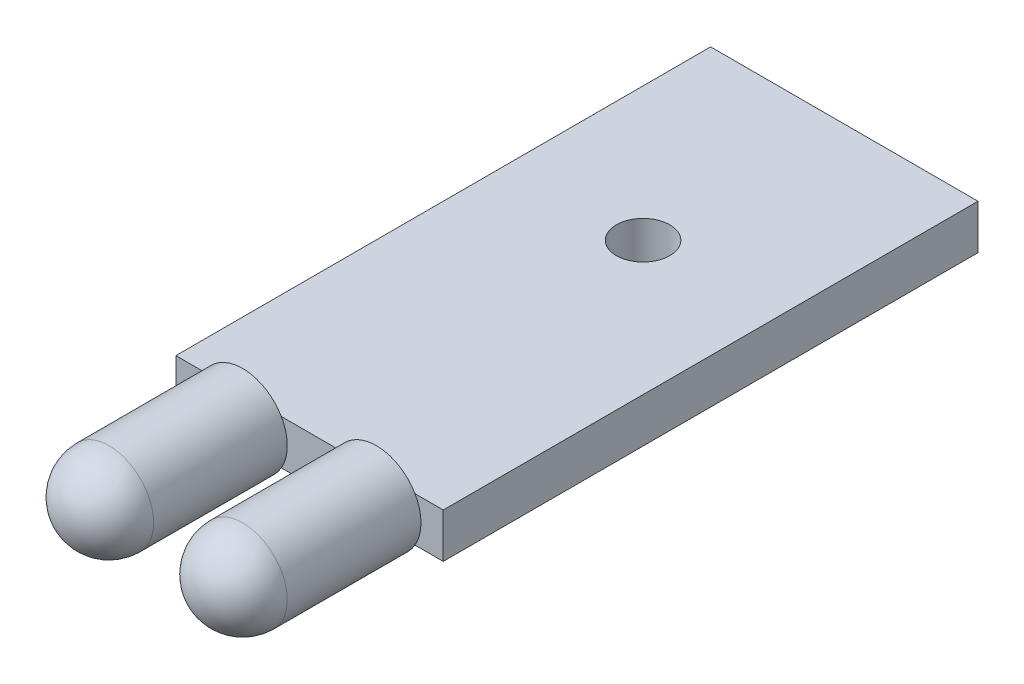
ISO-10303-21;
HEADER;
FILE_DESCRIPTION(('STEP AP214'),'2;1');
FILE_NAME('part.step','',(''),(''),'','','');
FILE_SCHEMA(('AUTOMOTIVE_DESIGN { 1 0 10303 214 1 1 1 1 }'));
ENDSEC;
DATA;
#1=APPLICATION_CONTEXT('core data for automotive mechanical design processes');
#2=APPLICATION_PROTOCOL_DEFINITION('international standard','automotive_design',2000,#1);
#3=PRODUCT_CONTEXT('',#1,'mechanical');
#4=PRODUCT('Part','Part','',(#3));
#5=PRODUCT_RELATED_PRODUCT_CATEGORY('part','',(#4));
#6=PRODUCT_DEFINITION_FORMATION('','',#4);
#7=PRODUCT_DEFINITION_CONTEXT('part definition',#1,'design');
#8=PRODUCT_DEFINITION('design','',#6,#7);
#9=PRODUCT_DEFINITION_SHAPE('','',#8);
#10=(LENGTH_UNIT() NAMED_UNIT(*) SI_UNIT(.MILLI.,.METRE.));
#11=(NAMED_UNIT(*) PLANE_ANGLE_UNIT() SI_UNIT($,.RADIAN.));
#12=(NAMED_UNIT(*) SI_UNIT($,.STERADIAN.) SOLID_ANGLE_UNIT());
#13=UNCERTAINTY_MEASURE_WITH_UNIT(LENGTH_MEASURE(1.E-05),#10,'distance_accuracy_value','');
#14=(GEOMETRIC_REPRESENTATION_CONTEXT(3) GLOBAL_UNCERTAINTY_ASSIGNED_CONTEXT((#13)) GLOBAL_UNIT_ASSIGNED_CONTEXT((#10,
#11,#12)) REPRESENTATION_CONTEXT('',''));
#15=CARTESIAN_POINT('',(0.,0.,0.));
#16=DIRECTION('',(0.,0.,1.));
#17=DIRECTION('',(1.,0.,0.));
#18=AXIS2_PLACEMENT_3D('',#15,#16,#17);
#19=CARTESIAN_POINT('',(0.,2.5,0.));
#20=DIRECTION('',(0.,0.,-1.));
#21=DIRECTION('',(-1.,0.,0.));
#22=AXIS2_PLACEMENT_3D('',#19,#20,#21);
#23=PLANE('',#22);
#24=CARTESIAN_POINT('',(-11.25,1.25,0.));
#25=DIRECTION('',(0.,0.,1.));
#26=DIRECTION('',(1.,0.,0.));
#27=AXIS2_PLACEMENT_3D('',#24,#25,#26);
#28=CIRCLE('',#27,2.5);
#29=CARTESIAN_POINT('',(-9.0849364905389,0.,0.));
#30=VERTEX_POINT('',#29);
#31=CARTESIAN_POINT('',(-9.0849364905389,2.5,0.));
#32=VERTEX_POINT('',#31);
#33=EDGE_CURVE('E160',#30,#32,#28,.T.);
#34=ORIENTED_EDGE('',*,*,#33,.F.);
#35=DIRECTION('',(1.,0.,0.));
#36=VECTOR('',#35,1.);
#37=CARTESIAN_POINT('',(0.,0.,0.));
#38=LINE('',#37,#36);
#39=CARTESIAN_POINT('',(-5.9150635094611,0.,0.));
#40=VERTEX_POINT('',#39);
#41=EDGE_CURVE('E146',#30,#40,#38,.T.);
#42=ORIENTED_EDGE('',*,*,#41,.T.);
#43=CARTESIAN_POINT('',(-3.75,1.25,0.));
#44=DIRECTION('',(0.,0.,1.));
#45=DIRECTION('',(1.,0.,0.));
#46=AXIS2_PLACEMENT_3D('',#43,#44,#45);
#47=CIRCLE('',#46,2.5);
#48=CARTESIAN_POINT('',(-5.9150635094611,2.5,0.));
#49=VERTEX_POINT('',#48);
#50=EDGE_CURVE('E234',#40,#49,#47,.F.);
#51=ORIENTED_EDGE('',*,*,#50,.T.);
#52=DIRECTION('',(1.,0.,0.));
#53=VECTOR('',#52,1.);
#54=CARTESIAN_POINT('',(0.,2.5,0.));
#55=LINE('',#54,#53);
#56=EDGE_CURVE('E94',#32,#49,#55,.T.);
#57=ORIENTED_EDGE('',*,*,#56,.F.);
#58=EDGE_LOOP('',(#34,#42,#51,#57));
#59=FACE_BOUND('',#58,.T.);
#60=ADVANCED_FACE('F77',(#59),#23,.F.);
#61=CARTESIAN_POINT('',(-13.4150635094611,2.5,0.));
#62=VERTEX_POINT('',#61);
#63=CARTESIAN_POINT('',(-13.4150635094611,0.,0.));
#64=VERTEX_POINT('',#63);
#65=EDGE_CURVE('E102',#62,#64,#28,.T.);
#66=ORIENTED_EDGE('',*,*,#65,.F.);
#67=CARTESIAN_POINT('',(-15.,2.5,0.));
#68=VERTEX_POINT('',#67);
#69=EDGE_CURVE('E202',#68,#62,#55,.T.);
#70=ORIENTED_EDGE('',*,*,#69,.F.);
#71=DIRECTION('',(0.,-1.,0.));
#72=VECTOR('',#71,1.);
#73=CARTESIAN_POINT('',(-15.,2.5,0.));
#74=LINE('',#73,#72);
#75=CARTESIAN_POINT('',(-15.,0.,0.));
#76=VERTEX_POINT('',#75);
#77=EDGE_CURVE('E220',#68,#76,#74,.T.);
#78=ORIENTED_EDGE('',*,*,#77,.T.);
#79=EDGE_CURVE('E158',#76,#64,#38,.T.);
#80=ORIENTED_EDGE('',*,*,#79,.T.);
#81=EDGE_LOOP('',(#66,#70,#78,#80));
#82=FACE_BOUND('',#81,.T.);
#83=ADVANCED_FACE('F272',(#82),#23,.F.);
#84=CARTESIAN_POINT('',(0.,2.5,0.));
#85=DIRECTION('',(-1.,0.,0.));
#86=DIRECTION('',(0.,0.,1.));
#87=AXIS2_PLACEMENT_3D('',#84,#85,#86);
#88=PLANE('',#87);
#89=DIRECTION('',(0.,0.,-1.));
#90=VECTOR('',#89,1.);
#91=CARTESIAN_POINT('',(0.,0.,0.));
#92=LINE('',#91,#90);
#93=CARTESIAN_POINT('',(0.,0.,0.));
#94=VERTEX_POINT('',#93);
#95=CARTESIAN_POINT('',(0.,0.,-30.));
#96=VERTEX_POINT('',#95);
#97=EDGE_CURVE('E189',#94,#96,#92,.T.);
#98=ORIENTED_EDGE('',*,*,#97,.T.);
#99=DIRECTION('',(0.,-1.,0.));
#100=VECTOR('',#99,1.);
#101=CARTESIAN_POINT('',(0.,2.5,-30.));
#102=LINE('',#101,#100);
#103=CARTESIAN_POINT('',(0.,2.5,-30.));
#104=VERTEX_POINT('',#103);
#105=EDGE_CURVE('E228',#104,#96,#102,.T.);
#106=ORIENTED_EDGE('',*,*,#105,.F.);
#107=DIRECTION('',(0.,0.,-1.));
#108=VECTOR('',#107,1.);
#109=CARTESIAN_POINT('',(0.,2.5,0.));
#110=LINE('',#109,#108);
#111=CARTESIAN_POINT('',(0.,2.5,0.));
#112=VERTEX_POINT('',#111);
#113=EDGE_CURVE('E191',#112,#104,#110,.T.);
#114=ORIENTED_EDGE('',*,*,#113,.F.);
#115=DIRECTION('',(0.,-1.,0.));
#116=VECTOR('',#115,1.);
#117=CARTESIAN_POINT('',(0.,2.5,0.));
#118=LINE('',#117,#116);
#119=EDGE_CURVE('E205',#112,#94,#118,.T.);
#120=ORIENTED_EDGE('',*,*,#119,.T.);
#121=EDGE_LOOP('',(#98,#106,#114,#120));
#122=FACE_BOUND('',#121,.T.);
#123=ADVANCED_FACE('F261',(#122),#88,.F.);
#124=CARTESIAN_POINT('',(0.,2.5,-30.));
#125=DIRECTION('',(0.,0.,1.));
#126=DIRECTION('',(1.,0.,0.));
#127=AXIS2_PLACEMENT_3D('',#124,#125,#126);
#128=PLANE('',#127);
#129=DIRECTION('',(-1.,0.,0.));
#130=VECTOR('',#129,1.);
#131=CARTESIAN_POINT('',(0.,0.,-30.));
#132=LINE('',#131,#130);
#133=CARTESIAN_POINT('',(-15.,0.,-30.));
#134=VERTEX_POINT('',#133);
#135=EDGE_CURVE('E210',#96,#134,#132,.T.);
#136=ORIENTED_EDGE('',*,*,#135,.T.);
#137=DIRECTION('',(0.,-1.,0.));
#138=VECTOR('',#137,1.);
#139=CARTESIAN_POINT('',(-15.,2.5,-30.));
#140=LINE('',#139,#138);
#141=CARTESIAN_POINT('',(-15.,2.5,-30.));
#142=VERTEX_POINT('',#141);
#143=EDGE_CURVE('E224',#142,#134,#140,.T.);
#144=ORIENTED_EDGE('',*,*,#143,.F.);
#145=DIRECTION('',(-1.,0.,0.));
#146=VECTOR('',#145,1.);
#147=CARTESIAN_POINT('',(0.,2.5,-30.));
#148=LINE('',#147,#146);
#149=EDGE_CURVE('E195',#104,#142,#148,.T.);
#150=ORIENTED_EDGE('',*,*,#149,.F.);
#151=ORIENTED_EDGE('',*,*,#105,.T.);
#152=EDGE_LOOP('',(#136,#144,#150,#151));
#153=FACE_BOUND('',#152,.T.);
#154=ADVANCED_FACE('F266',(#153),#128,.F.);
#155=CARTESIAN_POINT('',(-15.,2.5,0.));
#156=DIRECTION('',(1.,0.,0.));
#157=DIRECTION('',(0.,0.,-1.));
#158=AXIS2_PLACEMENT_3D('',#155,#156,#157);
#159=PLANE('',#158);
#160=DIRECTION('',(0.,0.,1.));
#161=VECTOR('',#160,1.);
#162=CARTESIAN_POINT('',(-15.,0.,0.));
#163=LINE('',#162,#161);
#164=EDGE_CURVE('E213',#134,#76,#163,.T.);
#165=ORIENTED_EDGE('',*,*,#164,.T.);
#166=ORIENTED_EDGE('',*,*,#77,.F.);
#167=DIRECTION('',(0.,0.,1.));
#168=VECTOR('',#167,1.);
#169=CARTESIAN_POINT('',(-15.,2.5,0.));
#170=LINE('',#169,#168);
#171=EDGE_CURVE('E198',#142,#68,#170,.T.);
#172=ORIENTED_EDGE('',*,*,#171,.F.);
#173=ORIENTED_EDGE('',*,*,#143,.T.);
#174=EDGE_LOOP('',(#165,#166,#172,#173));
#175=FACE_BOUND('',#174,.T.);
#176=ADVANCED_FACE('F271',(#175),#159,.F.);
#177=CARTESIAN_POINT('',(-1.5849364905389,2.5,0.));
#178=VERTEX_POINT('',#177);
#179=EDGE_CURVE('E201',#178,#112,#55,.T.);
#180=ORIENTED_EDGE('',*,*,#179,.F.);
#181=CARTESIAN_POINT('',(-1.5849364905389,0.,0.));
#182=VERTEX_POINT('',#181);
#183=EDGE_CURVE('E190',#178,#182,#47,.F.);
#184=ORIENTED_EDGE('',*,*,#183,.T.);
#185=EDGE_CURVE('E173',#182,#94,#38,.T.);
#186=ORIENTED_EDGE('',*,*,#185,.T.);
#187=ORIENTED_EDGE('',*,*,#119,.F.);
#188=EDGE_LOOP('',(#180,#184,#186,#187));
#189=FACE_BOUND('',#188,.T.);
#190=ADVANCED_FACE('F251',(#189),#23,.F.);
#191=CARTESIAN_POINT('',(0.,2.5,0.));
#192=DIRECTION('',(0.,1.,0.));
#193=DIRECTION('',(0.,0.,1.));
#194=AXIS2_PLACEMENT_3D('',#191,#192,#193);
#195=PLANE('',#194);
#196=CARTESIAN_POINT('',(-7.5,2.5,-18.71));
#197=DIRECTION('',(0.,1.,0.));
#198=DIRECTION('',(0.,0.,1.));
#199=AXIS2_PLACEMENT_3D('',#196,#197,#198);
#200=CIRCLE('',#199,1.5);
#201=CARTESIAN_POINT('',(-7.5,2.5,-17.21));
#202=VERTEX_POINT('',#201);
#203=EDGE_CURVE('E181',#202,#202,#200,.T.);
#204=ORIENTED_EDGE('',*,*,#203,.F.);
#205=EDGE_LOOP('',(#204));
#206=FACE_BOUND('',#205,.T.);
#207=ORIENTED_EDGE('',*,*,#113,.T.);
#208=ORIENTED_EDGE('',*,*,#149,.T.);
#209=ORIENTED_EDGE('',*,*,#171,.T.);
#210=ORIENTED_EDGE('',*,*,#69,.T.);
#211=DIRECTION('',(1.,0.,0.));
#212=VECTOR('',#211,1.);
#213=CARTESIAN_POINT('',(0.,2.5,0.));
#214=LINE('',#213,#212);
#215=EDGE_CURVE('E180',#62,#32,#214,.T.);
#216=ORIENTED_EDGE('',*,*,#215,.T.);
#217=ORIENTED_EDGE('',*,*,#56,.T.);
#218=EDGE_CURVE('E206',#49,#178,#55,.T.);
#219=ORIENTED_EDGE('',*,*,#218,.T.);
#220=ORIENTED_EDGE('',*,*,#179,.T.);
#221=EDGE_LOOP('',(#207,#208,#209,#210,#216,#217,#219,#220));
#222=FACE_BOUND('',#221,.T.);
#223=ADVANCED_FACE('F255',(#206,#222),#195,.T.);
#224=CARTESIAN_POINT('',(0.,0.,0.));
#225=DIRECTION('',(0.,1.,0.));
#226=DIRECTION('',(0.,0.,1.));
#227=AXIS2_PLACEMENT_3D('',#224,#225,#226);
#228=PLANE('',#227);
#229=CARTESIAN_POINT('',(-7.5,0.,-18.71));
#230=DIRECTION('',(0.,1.,0.));
#231=DIRECTION('',(0.,0.,1.));
#232=AXIS2_PLACEMENT_3D('',#229,#230,#231);
#233=CIRCLE('',#232,1.5);
#234=CARTESIAN_POINT('',(-7.5,0.,-17.21));
#235=VERTEX_POINT('',#234);
#236=EDGE_CURVE('E81',#235,#235,#233,.T.);
#237=ORIENTED_EDGE('',*,*,#236,.T.);
#238=EDGE_LOOP('',(#237));
#239=FACE_BOUND('',#238,.T.);
#240=ORIENTED_EDGE('',*,*,#97,.F.);
#241=ORIENTED_EDGE('',*,*,#185,.F.);
#242=EDGE_CURVE('E154',#40,#182,#38,.T.);
#243=ORIENTED_EDGE('',*,*,#242,.F.);
#244=ORIENTED_EDGE('',*,*,#41,.F.);
#245=EDGE_CURVE('E151',#64,#30,#38,.T.);
#246=ORIENTED_EDGE('',*,*,#245,.F.);
#247=ORIENTED_EDGE('',*,*,#79,.F.);
#248=ORIENTED_EDGE('',*,*,#164,.F.);
#249=ORIENTED_EDGE('',*,*,#135,.F.);
#250=EDGE_LOOP('',(#240,#241,#243,#244,#246,#247,#248,#249));
#251=FACE_BOUND('',#250,.T.);
#252=ADVANCED_FACE('F148',(#239,#251),#228,.F.);
#253=CARTESIAN_POINT('',(0.,0.,0.));
#254=DIRECTION('',(0.,0.,1.));
#255=DIRECTION('',(1.,0.,0.));
#256=AXIS2_PLACEMENT_3D('',#253,#254,#255);
#257=PLANE('',#256);
#258=EDGE_CURVE('E185',#182,#40,#47,.F.);
#259=ORIENTED_EDGE('',*,*,#258,.T.);
#260=ORIENTED_EDGE('',*,*,#242,.T.);
#261=EDGE_LOOP('',(#259,#260));
#262=FACE_BOUND('',#261,.T.);
#263=ADVANCED_FACE('F317',(#262),#257,.F.);
#264=CARTESIAN_POINT('',(-3.75,1.25,10.));
#265=DIRECTION('',(0.,0.,-1.));
#266=DIRECTION('',(-1.,0.,0.));
#267=AXIS2_PLACEMENT_3D('',#264,#265,#266);
#268=CYLINDRICAL_SURFACE('',#267,2.5);
#269=CARTESIAN_POINT('',(-3.75,1.25,7.5));
#270=DIRECTION('',(0.,0.,-1.));
#271=DIRECTION('',(-1.,0.,0.));
#272=AXIS2_PLACEMENT_3D('',#269,#270,#271);
#273=CIRCLE('',#272,2.5);
#274=CARTESIAN_POINT('',(-6.25,1.25,7.5));
#275=VERTEX_POINT('',#274);
#276=EDGE_CURVE('E12',#275,#275,#273,.T.);
#277=ORIENTED_EDGE('',*,*,#276,.T.);
#278=EDGE_LOOP('',(#277));
#279=FACE_BOUND('',#278,.T.);
#280=ORIENTED_EDGE('',*,*,#258,.F.);
#281=ORIENTED_EDGE('',*,*,#183,.F.);
#282=EDGE_CURVE('E184',#49,#178,#47,.F.);
#283=ORIENTED_EDGE('',*,*,#282,.F.);
#284=ORIENTED_EDGE('',*,*,#50,.F.);
#285=EDGE_LOOP('',(#280,#281,#283,#284));
#286=FACE_BOUND('',#285,.T.);
#287=ADVANCED_FACE('F312',(#279,#286),#268,.T.);
#288=ORIENTED_EDGE('',*,*,#218,.F.);
#289=ORIENTED_EDGE('',*,*,#282,.T.);
#290=EDGE_LOOP('',(#288,#289));
#291=FACE_BOUND('',#290,.T.);
#292=ADVANCED_FACE('F246',(#291),#257,.F.);
#293=CARTESIAN_POINT('',(0.,0.,0.));
#294=DIRECTION('',(0.,0.,1.));
#295=DIRECTION('',(1.,0.,0.));
#296=AXIS2_PLACEMENT_3D('',#293,#294,#295);
#297=PLANE('',#296);
#298=EDGE_CURVE('E166',#64,#30,#28,.T.);
#299=ORIENTED_EDGE('',*,*,#298,.F.);
#300=ORIENTED_EDGE('',*,*,#245,.T.);
#301=EDGE_LOOP('',(#299,#300));
#302=FACE_BOUND('',#301,.T.);
#303=ADVANCED_FACE('F171',(#302),#297,.F.);
#304=ORIENTED_EDGE('',*,*,#215,.F.);
#305=EDGE_CURVE('E168',#32,#62,#28,.T.);
#306=ORIENTED_EDGE('',*,*,#305,.F.);
#307=EDGE_LOOP('',(#304,#306));
#308=FACE_BOUND('',#307,.T.);
#309=ADVANCED_FACE('F297',(#308),#297,.F.);
#310=CARTESIAN_POINT('',(-11.25,1.25,10.));
#311=DIRECTION('',(0.,0.,-1.));
#312=DIRECTION('',(-1.,0.,0.));
#313=AXIS2_PLACEMENT_3D('',#310,#311,#312);
#314=CYLINDRICAL_SURFACE('',#313,2.5);
#315=CARTESIAN_POINT('',(-11.25,1.25,7.5));
#316=DIRECTION('',(0.,0.,-1.));
#317=DIRECTION('',(-1.,0.,0.));
#318=AXIS2_PLACEMENT_3D('',#315,#316,#317);
#319=CIRCLE('',#318,2.5);
#320=CARTESIAN_POINT('',(-13.75,1.25,7.5));
#321=VERTEX_POINT('',#320);
#322=EDGE_CURVE('E87',#321,#321,#319,.T.);
#323=ORIENTED_EDGE('',*,*,#322,.T.);
#324=EDGE_LOOP('',(#323));
#325=FACE_BOUND('',#324,.T.);
#326=ORIENTED_EDGE('',*,*,#305,.T.);
#327=ORIENTED_EDGE('',*,*,#65,.T.);
#328=ORIENTED_EDGE('',*,*,#298,.T.);
#329=ORIENTED_EDGE('',*,*,#33,.T.);
#330=EDGE_LOOP('',(#326,#327,#328,#329));
#331=FACE_BOUND('',#330,.T.);
#332=ADVANCED_FACE('F174',(#325,#331),#314,.T.);
#333=CARTESIAN_POINT('',(-11.25,1.25,7.5));
#334=DIRECTION('',(0.,0.,1.));
#335=DIRECTION('',(1.,0.,0.));
#336=AXIS2_PLACEMENT_3D('',#333,#334,#335);
#337=SPHERICAL_SURFACE('',#336,2.5);
#338=ORIENTED_EDGE('',*,*,#322,.F.);
#339=EDGE_LOOP('',(#338));
#340=FACE_BOUND('',#339,.T.);
#341=ADVANCED_FACE('F294',(#340),#337,.T.);
#342=CARTESIAN_POINT('',(-3.75,1.25,7.5));
#343=DIRECTION('',(0.,0.,1.));
#344=DIRECTION('',(1.,0.,0.));
#345=AXIS2_PLACEMENT_3D('',#342,#343,#344);
#346=SPHERICAL_SURFACE('',#345,2.5);
#347=ORIENTED_EDGE('',*,*,#276,.F.);
#348=EDGE_LOOP('',(#347));
#349=FACE_BOUND('',#348,.T.);
#350=ADVANCED_FACE('F79',(#349),#346,.T.);
#351=CARTESIAN_POINT('',(-7.5,2.5,-18.71));
#352=DIRECTION('',(0.,1.,0.));
#353=DIRECTION('',(0.,0.,1.));
#354=AXIS2_PLACEMENT_3D('',#351,#352,#353);
#355=CYLINDRICAL_SURFACE('',#354,1.5);
#356=ORIENTED_EDGE('',*,*,#203,.T.);
#357=EDGE_LOOP('',(#356));
#358=FACE_BOUND('',#357,.T.);
#359=ORIENTED_EDGE('',*,*,#236,.F.);
#360=EDGE_LOOP('',(#359));
#361=FACE_BOUND('',#360,.T.);
#362=ADVANCED_FACE('F303',(#358,#361),#355,.F.);
#363=CLOSED_SHELL('',(#60,#83,#123,#154,#176,#190,#223,#252,#263,#287,#292,#303,#309,#332,#341,
#350,#362));
#364=MANIFOLD_SOLID_BREP('B2',#363);
#365=ADVANCED_BREP_SHAPE_REPRESENTATION('',(#18,#364),#14);
#366=SHAPE_DEFINITION_REPRESENTATION(#9,#365);
ENDSEC;
END-ISO-10303-21;
